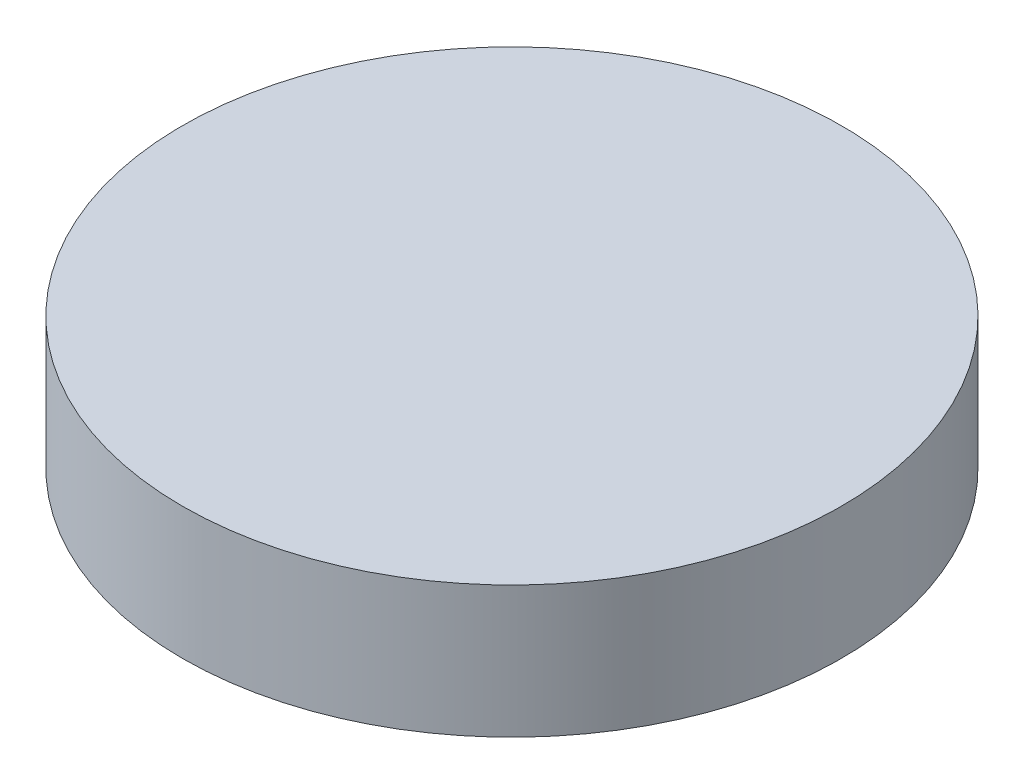
ISO-10303-21;
HEADER;
FILE_DESCRIPTION(('STEP AP214'),'2;1');
FILE_NAME('part.step','',(''),(''),'','','');
FILE_SCHEMA(('AUTOMOTIVE_DESIGN { 1 0 10303 214 1 1 1 1 }'));
ENDSEC;
DATA;
#1=APPLICATION_CONTEXT('core data for automotive mechanical design processes');
#2=APPLICATION_PROTOCOL_DEFINITION('international standard','automotive_design',2000,#1);
#3=PRODUCT_CONTEXT('',#1,'mechanical');
#4=PRODUCT('Part','Part','',(#3));
#5=PRODUCT_RELATED_PRODUCT_CATEGORY('part','',(#4));
#6=PRODUCT_DEFINITION_FORMATION('','',#4);
#7=PRODUCT_DEFINITION_CONTEXT('part definition',#1,'design');
#8=PRODUCT_DEFINITION('design','',#6,#7);
#9=PRODUCT_DEFINITION_SHAPE('','',#8);
#10=(LENGTH_UNIT() NAMED_UNIT(*) SI_UNIT(.MILLI.,.METRE.));
#11=(NAMED_UNIT(*) PLANE_ANGLE_UNIT() SI_UNIT($,.RADIAN.));
#12=(NAMED_UNIT(*) SI_UNIT($,.STERADIAN.) SOLID_ANGLE_UNIT());
#13=UNCERTAINTY_MEASURE_WITH_UNIT(LENGTH_MEASURE(1.E-05),#10,'distance_accuracy_value','');
#14=(GEOMETRIC_REPRESENTATION_CONTEXT(3) GLOBAL_UNCERTAINTY_ASSIGNED_CONTEXT((#13)) GLOBAL_UNIT_ASSIGNED_CONTEXT((#10,
#11,#12)) REPRESENTATION_CONTEXT('',''));
#15=CARTESIAN_POINT('',(0.,0.,0.));
#16=DIRECTION('',(0.,0.,1.));
#17=DIRECTION('',(1.,0.,0.));
#18=AXIS2_PLACEMENT_3D('',#15,#16,#17);
#19=CARTESIAN_POINT('',(0.,4.,0.));
#20=DIRECTION('',(0.,-1.,0.));
#21=DIRECTION('',(0.,0.,-1.));
#22=AXIS2_PLACEMENT_3D('',#19,#20,#21);
#23=CYLINDRICAL_SURFACE('',#22,10.);
#24=CARTESIAN_POINT('',(0.,4.,0.));
#25=DIRECTION('',(0.,1.,0.));
#26=DIRECTION('',(0.,0.,1.));
#27=AXIS2_PLACEMENT_3D('',#24,#25,#26);
#28=CIRCLE('',#27,10.);
#29=CARTESIAN_POINT('',(0.,4.,10.));
#30=VERTEX_POINT('',#29);
#31=EDGE_CURVE('E10',#30,#30,#28,.T.);
#32=ORIENTED_EDGE('',*,*,#31,.F.);
#33=EDGE_LOOP('',(#32));
#34=FACE_BOUND('',#33,.T.);
#35=CARTESIAN_POINT('',(0.,0.,0.));
#36=DIRECTION('',(0.,1.,0.));
#37=DIRECTION('',(0.,0.,1.));
#38=AXIS2_PLACEMENT_3D('',#35,#36,#37);
#39=CIRCLE('',#38,10.);
#40=CARTESIAN_POINT('',(0.,0.,10.));
#41=VERTEX_POINT('',#40);
#42=EDGE_CURVE('E44',#41,#41,#39,.T.);
#43=ORIENTED_EDGE('',*,*,#42,.T.);
#44=EDGE_LOOP('',(#43));
#45=FACE_BOUND('',#44,.T.);
#46=ADVANCED_FACE('F41',(#34,#45),#23,.T.);
#47=CARTESIAN_POINT('',(0.,4.,0.));
#48=DIRECTION('',(0.,1.,0.));
#49=DIRECTION('',(0.,0.,1.));
#50=AXIS2_PLACEMENT_3D('',#47,#48,#49);
#51=PLANE('',#50);
#52=ORIENTED_EDGE('',*,*,#31,.T.);
#53=EDGE_LOOP('',(#52));
#54=FACE_BOUND('',#53,.T.);
#55=ADVANCED_FACE('F58',(#54),#51,.T.);
#56=CARTESIAN_POINT('',(0.,0.,0.));
#57=DIRECTION('',(0.,1.,0.));
#58=DIRECTION('',(0.,0.,1.));
#59=AXIS2_PLACEMENT_3D('',#56,#57,#58);
#60=PLANE('',#59);
#61=ORIENTED_EDGE('',*,*,#42,.F.);
#62=EDGE_LOOP('',(#61));
#63=FACE_BOUND('',#62,.T.);
#64=ADVANCED_FACE('F56',(#63),#60,.F.);
#65=CLOSED_SHELL('',(#46,#55,#64));
#66=MANIFOLD_SOLID_BREP('B2',#65);
#67=ADVANCED_BREP_SHAPE_REPRESENTATION('',(#18,#66),#14);
#68=SHAPE_DEFINITION_REPRESENTATION(#9,#67);
ENDSEC;
END-ISO-10303-21;
